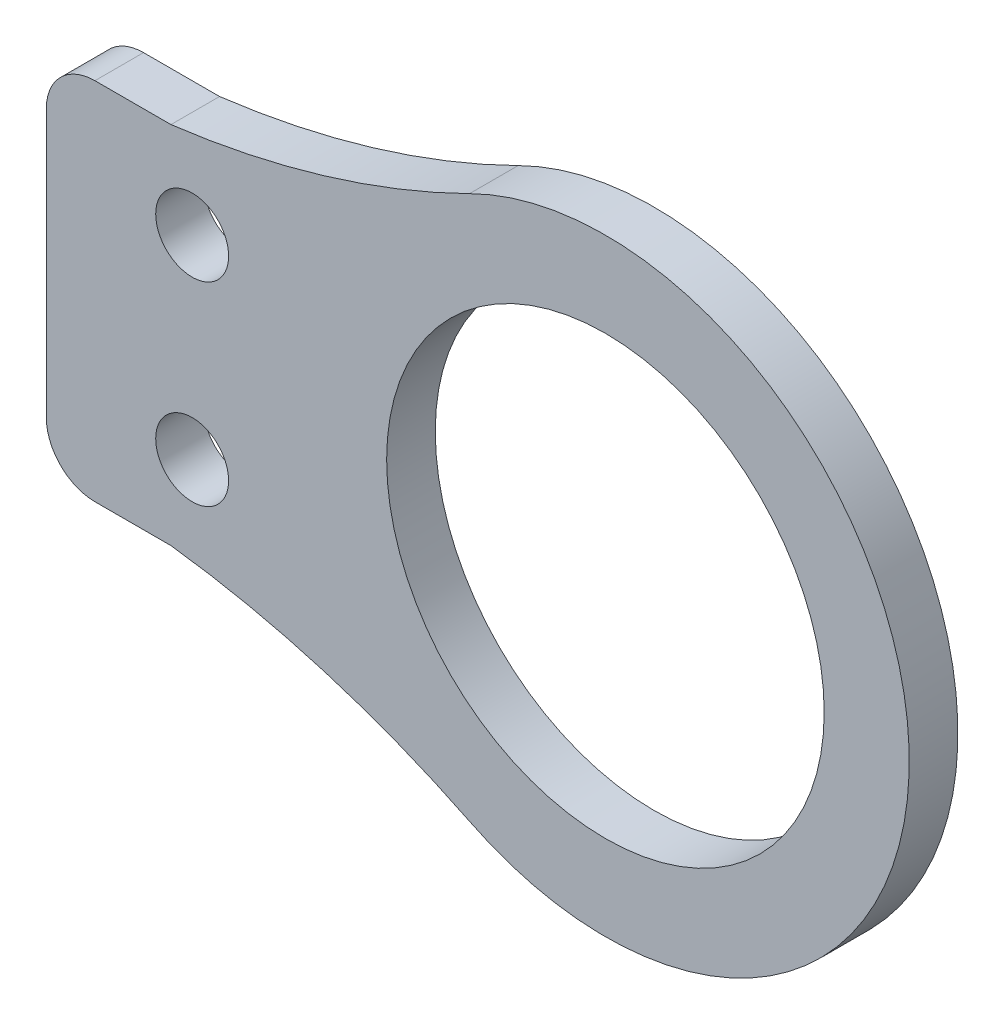
ISO-10303-21;
HEADER;
FILE_DESCRIPTION(('STEP AP214'),'2;1');
FILE_NAME('part.step','',(''),(''),'','','');
FILE_SCHEMA(('AUTOMOTIVE_DESIGN { 1 0 10303 214 1 1 1 1 }'));
ENDSEC;
DATA;
#1=APPLICATION_CONTEXT('core data for automotive mechanical design processes');
#2=APPLICATION_PROTOCOL_DEFINITION('international standard','automotive_design',2000,#1);
#3=PRODUCT_CONTEXT('',#1,'mechanical');
#4=PRODUCT('Part','Part','',(#3));
#5=PRODUCT_RELATED_PRODUCT_CATEGORY('part','',(#4));
#6=PRODUCT_DEFINITION_FORMATION('','',#4);
#7=PRODUCT_DEFINITION_CONTEXT('part definition',#1,'design');
#8=PRODUCT_DEFINITION('design','',#6,#7);
#9=PRODUCT_DEFINITION_SHAPE('','',#8);
#10=(LENGTH_UNIT() NAMED_UNIT(*) SI_UNIT(.MILLI.,.METRE.));
#11=(NAMED_UNIT(*) PLANE_ANGLE_UNIT() SI_UNIT($,.RADIAN.));
#12=(NAMED_UNIT(*) SI_UNIT($,.STERADIAN.) SOLID_ANGLE_UNIT());
#13=UNCERTAINTY_MEASURE_WITH_UNIT(LENGTH_MEASURE(1.E-05),#10,'distance_accuracy_value','');
#14=(GEOMETRIC_REPRESENTATION_CONTEXT(3) GLOBAL_UNCERTAINTY_ASSIGNED_CONTEXT((#13)) GLOBAL_UNIT_ASSIGNED_CONTEXT((#10,
#11,#12)) REPRESENTATION_CONTEXT('',''));
#15=CARTESIAN_POINT('',(0.,0.,0.));
#16=DIRECTION('',(0.,0.,1.));
#17=DIRECTION('',(1.,0.,0.));
#18=AXIS2_PLACEMENT_3D('',#15,#16,#17);
#19=CARTESIAN_POINT('',(0.,0.,1.));
#20=DIRECTION('',(0.,0.,-1.));
#21=DIRECTION('',(-1.,0.,0.));
#22=AXIS2_PLACEMENT_3D('',#19,#20,#21);
#23=CYLINDRICAL_SURFACE('',#22,12.5);
#24=DIRECTION('',(0.,0.,-1.));
#25=VECTOR('',#24,1.);
#26=CARTESIAN_POINT('',(-5.59081615330965,11.1800167593744,1.));
#27=LINE('',#26,#25);
#28=CARTESIAN_POINT('',(-5.59081615330965,11.1800167593744,1.));
#29=VERTEX_POINT('',#28);
#30=CARTESIAN_POINT('',(-5.59081615330965,11.1800167593744,-1.));
#31=VERTEX_POINT('',#30);
#32=EDGE_CURVE('E120',#29,#31,#27,.T.);
#33=ORIENTED_EDGE('',*,*,#32,.F.);
#34=CARTESIAN_POINT('',(0.,0.,1.));
#35=DIRECTION('',(0.,0.,1.));
#36=DIRECTION('',(1.,0.,0.));
#37=AXIS2_PLACEMENT_3D('',#34,#35,#36);
#38=CIRCLE('',#37,12.5);
#39=CARTESIAN_POINT('',(-5.59081615330965,-11.1800167593744,1.));
#40=VERTEX_POINT('',#39);
#41=EDGE_CURVE('E160',#40,#29,#38,.T.);
#42=ORIENTED_EDGE('',*,*,#41,.F.);
#43=DIRECTION('',(0.,0.,-1.));
#44=VECTOR('',#43,1.);
#45=CARTESIAN_POINT('',(-5.59081615330965,-11.1800167593744,1.));
#46=LINE('',#45,#44);
#47=CARTESIAN_POINT('',(-5.59081615330965,-11.1800167593744,-1.));
#48=VERTEX_POINT('',#47);
#49=EDGE_CURVE('E153',#40,#48,#46,.T.);
#50=ORIENTED_EDGE('',*,*,#49,.T.);
#51=CARTESIAN_POINT('',(0.,0.,-1.));
#52=DIRECTION('',(0.,0.,-1.));
#53=DIRECTION('',(-1.,0.,0.));
#54=AXIS2_PLACEMENT_3D('',#51,#52,#53);
#55=CIRCLE('',#54,12.5);
#56=EDGE_CURVE('E124',#31,#48,#55,.T.);
#57=ORIENTED_EDGE('',*,*,#56,.F.);
#58=EDGE_LOOP('',(#33,#42,#50,#57));
#59=FACE_BOUND('',#58,.T.);
#60=ADVANCED_FACE('F36',(#59),#23,.T.);
#61=CARTESIAN_POINT('',(0.,0.,1.));
#62=DIRECTION('',(0.,0.,1.));
#63=DIRECTION('',(1.,0.,0.));
#64=AXIS2_PLACEMENT_3D('',#61,#62,#63);
#65=PLANE('',#64);
#66=DIRECTION('',(0.,1.,0.));
#67=VECTOR('',#66,1.);
#68=CARTESIAN_POINT('',(-23.,0.,1.));
#69=LINE('',#68,#67);
#70=CARTESIAN_POINT('',(-23.,-5.5,1.));
#71=VERTEX_POINT('',#70);
#72=CARTESIAN_POINT('',(-23.,5.5,1.));
#73=VERTEX_POINT('',#72);
#74=EDGE_CURVE('E148',#71,#73,#69,.T.);
#75=ORIENTED_EDGE('',*,*,#74,.F.);
#76=CARTESIAN_POINT('',(-21.,-5.5,1.));
#77=DIRECTION('',(0.,0.,1.));
#78=DIRECTION('',(1.,0.,0.));
#79=AXIS2_PLACEMENT_3D('',#76,#77,#78);
#80=CIRCLE('',#79,2.);
#81=CARTESIAN_POINT('',(-21.,-7.5,1.));
#82=VERTEX_POINT('',#81);
#83=EDGE_CURVE('E44',#71,#82,#80,.T.);
#84=ORIENTED_EDGE('',*,*,#83,.T.);
#85=DIRECTION('',(-1.,0.,0.));
#86=VECTOR('',#85,1.);
#87=CARTESIAN_POINT('',(0.,-7.5,1.));
#88=LINE('',#87,#86);
#89=CARTESIAN_POINT('',(-17.8724312422313,-7.5,1.));
#90=VERTEX_POINT('',#89);
#91=EDGE_CURVE('E145',#90,#82,#88,.T.);
#92=ORIENTED_EDGE('',*,*,#91,.F.);
#93=CARTESIAN_POINT('',(-22.6143040962932,-45.6596505253202,1.));
#94=DIRECTION('',(0.,0.,-1.));
#95=DIRECTION('',(-1.,0.,0.));
#96=AXIS2_PLACEMENT_3D('',#93,#94,#95);
#97=CIRCLE('',#96,38.4531440376292);
#98=EDGE_CURVE('E142',#40,#90,#97,.F.);
#99=ORIENTED_EDGE('',*,*,#98,.F.);
#100=ORIENTED_EDGE('',*,*,#41,.T.);
#101=CARTESIAN_POINT('',(-22.6143040962932,45.6596505253202,1.));
#102=DIRECTION('',(0.,0.,-1.));
#103=DIRECTION('',(-1.,0.,0.));
#104=AXIS2_PLACEMENT_3D('',#101,#102,#103);
#105=CIRCLE('',#104,38.4531440376292);
#106=CARTESIAN_POINT('',(-17.8724312422313,7.5,1.));
#107=VERTEX_POINT('',#106);
#108=EDGE_CURVE('E151',#29,#107,#105,.T.);
#109=ORIENTED_EDGE('',*,*,#108,.T.);
#110=DIRECTION('',(-1.,0.,0.));
#111=VECTOR('',#110,1.);
#112=CARTESIAN_POINT('',(0.,7.5,1.));
#113=LINE('',#112,#111);
#114=CARTESIAN_POINT('',(-21.,7.5,1.));
#115=VERTEX_POINT('',#114);
#116=EDGE_CURVE('E117',#107,#115,#113,.T.);
#117=ORIENTED_EDGE('',*,*,#116,.T.);
#118=CARTESIAN_POINT('',(-21.,5.5,1.));
#119=DIRECTION('',(0.,0.,1.));
#120=DIRECTION('',(1.,0.,0.));
#121=AXIS2_PLACEMENT_3D('',#118,#119,#120);
#122=CIRCLE('',#121,2.);
#123=EDGE_CURVE('E56',#115,#73,#122,.T.);
#124=ORIENTED_EDGE('',*,*,#123,.T.);
#125=EDGE_LOOP('',(#75,#84,#92,#99,#100,#109,#117,#124));
#126=FACE_BOUND('',#125,.T.);
#127=CARTESIAN_POINT('',(0.,0.,1.));
#128=DIRECTION('',(0.,0.,1.));
#129=DIRECTION('',(1.,0.,0.));
#130=AXIS2_PLACEMENT_3D('',#127,#128,#129);
#131=CIRCLE('',#130,9.);
#132=CARTESIAN_POINT('',(9.,0.,1.));
#133=VERTEX_POINT('',#132);
#134=EDGE_CURVE('E154',#133,#133,#131,.T.);
#135=ORIENTED_EDGE('',*,*,#134,.F.);
#136=EDGE_LOOP('',(#135));
#137=FACE_BOUND('',#136,.T.);
#138=CARTESIAN_POINT('',(-17.,4.,1.));
#139=DIRECTION('',(0.,0.,-1.));
#140=DIRECTION('',(-1.,0.,0.));
#141=AXIS2_PLACEMENT_3D('',#138,#139,#140);
#142=CIRCLE('',#141,1.5);
#143=CARTESIAN_POINT('',(-18.5,4.,1.));
#144=VERTEX_POINT('',#143);
#145=EDGE_CURVE('E136',#144,#144,#142,.T.);
#146=ORIENTED_EDGE('',*,*,#145,.T.);
#147=EDGE_LOOP('',(#146));
#148=FACE_BOUND('',#147,.T.);
#149=CARTESIAN_POINT('',(-17.,-4.,1.));
#150=DIRECTION('',(0.,0.,-1.));
#151=DIRECTION('',(-1.,0.,0.));
#152=AXIS2_PLACEMENT_3D('',#149,#150,#151);
#153=CIRCLE('',#152,1.5);
#154=CARTESIAN_POINT('',(-18.5,-4.,1.));
#155=VERTEX_POINT('',#154);
#156=EDGE_CURVE('E139',#155,#155,#153,.T.);
#157=ORIENTED_EDGE('',*,*,#156,.T.);
#158=EDGE_LOOP('',(#157));
#159=FACE_BOUND('',#158,.T.);
#160=ADVANCED_FACE('F176',(#126,#137,#148,#159),#65,.T.);
#161=CARTESIAN_POINT('',(0.,0.,1.));
#162=DIRECTION('',(0.,0.,-1.));
#163=DIRECTION('',(-1.,0.,0.));
#164=AXIS2_PLACEMENT_3D('',#161,#162,#163);
#165=CYLINDRICAL_SURFACE('',#164,9.);
#166=ORIENTED_EDGE('',*,*,#134,.T.);
#167=EDGE_LOOP('',(#166));
#168=FACE_BOUND('',#167,.T.);
#169=CARTESIAN_POINT('',(0.,0.,-1.));
#170=DIRECTION('',(0.,0.,-1.));
#171=DIRECTION('',(-1.,0.,0.));
#172=AXIS2_PLACEMENT_3D('',#169,#170,#171);
#173=CIRCLE('',#172,9.);
#174=CARTESIAN_POINT('',(-9.,0.,-1.));
#175=VERTEX_POINT('',#174);
#176=EDGE_CURVE('E235',#175,#175,#173,.T.);
#177=ORIENTED_EDGE('',*,*,#176,.T.);
#178=EDGE_LOOP('',(#177));
#179=FACE_BOUND('',#178,.T.);
#180=ADVANCED_FACE('F201',(#168,#179),#165,.F.);
#181=CARTESIAN_POINT('',(-22.6143040962932,45.6596505253202,1.));
#182=DIRECTION('',(0.,0.,-1.));
#183=DIRECTION('',(-1.,0.,0.));
#184=AXIS2_PLACEMENT_3D('',#181,#182,#183);
#185=CYLINDRICAL_SURFACE('',#184,38.4531440376292);
#186=ORIENTED_EDGE('',*,*,#32,.T.);
#187=CARTESIAN_POINT('',(-22.6143040962932,45.6596505253202,-1.));
#188=DIRECTION('',(0.,0.,1.));
#189=DIRECTION('',(-1.,0.,0.));
#190=AXIS2_PLACEMENT_3D('',#187,#188,#189);
#191=CIRCLE('',#190,38.4531440376292);
#192=CARTESIAN_POINT('',(-17.8724312422313,7.5,-1.));
#193=VERTEX_POINT('',#192);
#194=EDGE_CURVE('E108',#193,#31,#191,.T.);
#195=ORIENTED_EDGE('',*,*,#194,.F.);
#196=DIRECTION('',(0.,0.,-1.));
#197=VECTOR('',#196,1.);
#198=CARTESIAN_POINT('',(-17.8724312422313,7.5,1.));
#199=LINE('',#198,#197);
#200=EDGE_CURVE('E115',#107,#193,#199,.T.);
#201=ORIENTED_EDGE('',*,*,#200,.F.);
#202=ORIENTED_EDGE('',*,*,#108,.F.);
#203=EDGE_LOOP('',(#186,#195,#201,#202));
#204=FACE_BOUND('',#203,.T.);
#205=ADVANCED_FACE('F123',(#204),#185,.F.);
#206=CARTESIAN_POINT('',(0.,7.5,1.));
#207=DIRECTION('',(0.,-1.,0.));
#208=DIRECTION('',(0.,0.,-1.));
#209=AXIS2_PLACEMENT_3D('',#206,#207,#208);
#210=PLANE('',#209);
#211=DIRECTION('',(1.,0.,0.));
#212=VECTOR('',#211,1.);
#213=CARTESIAN_POINT('',(-23.,7.5,-1.));
#214=LINE('',#213,#212);
#215=CARTESIAN_POINT('',(-21.,7.5,-1.));
#216=VERTEX_POINT('',#215);
#217=EDGE_CURVE('E101',#216,#193,#214,.T.);
#218=ORIENTED_EDGE('',*,*,#217,.F.);
#219=DIRECTION('',(0.,0.,-1.));
#220=VECTOR('',#219,1.);
#221=CARTESIAN_POINT('',(-21.,7.5,1.));
#222=LINE('',#221,#220);
#223=EDGE_CURVE('E11',#216,#115,#222,.F.);
#224=ORIENTED_EDGE('',*,*,#223,.T.);
#225=ORIENTED_EDGE('',*,*,#116,.F.);
#226=ORIENTED_EDGE('',*,*,#200,.T.);
#227=EDGE_LOOP('',(#218,#224,#225,#226));
#228=FACE_BOUND('',#227,.T.);
#229=ADVANCED_FACE('F116',(#228),#210,.F.);
#230=CARTESIAN_POINT('',(-23.,0.,1.));
#231=DIRECTION('',(-1.,0.,0.));
#232=DIRECTION('',(0.,0.,1.));
#233=AXIS2_PLACEMENT_3D('',#230,#231,#232);
#234=PLANE('',#233);
#235=DIRECTION('',(0.,1.,0.));
#236=VECTOR('',#235,1.);
#237=CARTESIAN_POINT('',(-23.,-7.5,-1.));
#238=LINE('',#237,#236);
#239=CARTESIAN_POINT('',(-23.,-5.5,-1.));
#240=VERTEX_POINT('',#239);
#241=CARTESIAN_POINT('',(-23.,5.5,-1.));
#242=VERTEX_POINT('',#241);
#243=EDGE_CURVE('E134',#240,#242,#238,.T.);
#244=ORIENTED_EDGE('',*,*,#243,.F.);
#245=DIRECTION('',(0.,0.,-1.));
#246=VECTOR('',#245,1.);
#247=CARTESIAN_POINT('',(-23.,-5.5,1.));
#248=LINE('',#247,#246);
#249=EDGE_CURVE('E172',#240,#71,#248,.F.);
#250=ORIENTED_EDGE('',*,*,#249,.T.);
#251=ORIENTED_EDGE('',*,*,#74,.T.);
#252=DIRECTION('',(0.,0.,-1.));
#253=VECTOR('',#252,1.);
#254=CARTESIAN_POINT('',(-23.,5.5,-1.));
#255=LINE('',#254,#253);
#256=EDGE_CURVE('E169',#73,#242,#255,.T.);
#257=ORIENTED_EDGE('',*,*,#256,.T.);
#258=EDGE_LOOP('',(#244,#250,#251,#257));
#259=FACE_BOUND('',#258,.T.);
#260=ADVANCED_FACE('F188',(#259),#234,.T.);
#261=CARTESIAN_POINT('',(0.,-7.5,1.));
#262=DIRECTION('',(0.,-1.,0.));
#263=DIRECTION('',(0.,0.,-1.));
#264=AXIS2_PLACEMENT_3D('',#261,#262,#263);
#265=PLANE('',#264);
#266=ORIENTED_EDGE('',*,*,#91,.T.);
#267=DIRECTION('',(0.,0.,-1.));
#268=VECTOR('',#267,1.);
#269=CARTESIAN_POINT('',(-21.,-7.5,1.));
#270=LINE('',#269,#268);
#271=CARTESIAN_POINT('',(-21.,-7.5,-1.));
#272=VERTEX_POINT('',#271);
#273=EDGE_CURVE('E163',#82,#272,#270,.T.);
#274=ORIENTED_EDGE('',*,*,#273,.T.);
#275=DIRECTION('',(-1.,0.,0.));
#276=VECTOR('',#275,1.);
#277=CARTESIAN_POINT('',(-17.8724312422313,-7.5,-1.));
#278=LINE('',#277,#276);
#279=CARTESIAN_POINT('',(-17.8724312422313,-7.5,-1.));
#280=VERTEX_POINT('',#279);
#281=EDGE_CURVE('E132',#280,#272,#278,.T.);
#282=ORIENTED_EDGE('',*,*,#281,.F.);
#283=DIRECTION('',(0.,0.,-1.));
#284=VECTOR('',#283,1.);
#285=CARTESIAN_POINT('',(-17.8724312422313,-7.5,1.));
#286=LINE('',#285,#284);
#287=EDGE_CURVE('E121',#90,#280,#286,.T.);
#288=ORIENTED_EDGE('',*,*,#287,.F.);
#289=EDGE_LOOP('',(#266,#274,#282,#288));
#290=FACE_BOUND('',#289,.T.);
#291=ADVANCED_FACE('F183',(#290),#265,.T.);
#292=CARTESIAN_POINT('',(-17.,-4.,1.));
#293=DIRECTION('',(0.,0.,-1.));
#294=DIRECTION('',(-1.,0.,0.));
#295=AXIS2_PLACEMENT_3D('',#292,#293,#294);
#296=CYLINDRICAL_SURFACE('',#295,1.5);
#297=ORIENTED_EDGE('',*,*,#156,.F.);
#298=EDGE_LOOP('',(#297));
#299=FACE_BOUND('',#298,.T.);
#300=CARTESIAN_POINT('',(-17.,-4.,-1.));
#301=DIRECTION('',(0.,0.,-1.));
#302=DIRECTION('',(-1.,0.,0.));
#303=AXIS2_PLACEMENT_3D('',#300,#301,#302);
#304=CIRCLE('',#303,1.5);
#305=CARTESIAN_POINT('',(-18.5,-4.,-1.));
#306=VERTEX_POINT('',#305);
#307=EDGE_CURVE('E112',#306,#306,#304,.T.);
#308=ORIENTED_EDGE('',*,*,#307,.T.);
#309=EDGE_LOOP('',(#308));
#310=FACE_BOUND('',#309,.T.);
#311=ADVANCED_FACE('F211',(#299,#310),#296,.F.);
#312=CARTESIAN_POINT('',(-17.,4.,1.));
#313=DIRECTION('',(0.,0.,-1.));
#314=DIRECTION('',(-1.,0.,0.));
#315=AXIS2_PLACEMENT_3D('',#312,#313,#314);
#316=CYLINDRICAL_SURFACE('',#315,1.5);
#317=ORIENTED_EDGE('',*,*,#145,.F.);
#318=EDGE_LOOP('',(#317));
#319=FACE_BOUND('',#318,.T.);
#320=CARTESIAN_POINT('',(-17.,4.,-1.));
#321=DIRECTION('',(0.,0.,-1.));
#322=DIRECTION('',(-1.,0.,0.));
#323=AXIS2_PLACEMENT_3D('',#320,#321,#322);
#324=CIRCLE('',#323,1.5);
#325=CARTESIAN_POINT('',(-18.5,4.,-1.));
#326=VERTEX_POINT('',#325);
#327=EDGE_CURVE('E233',#326,#326,#324,.T.);
#328=ORIENTED_EDGE('',*,*,#327,.T.);
#329=EDGE_LOOP('',(#328));
#330=FACE_BOUND('',#329,.T.);
#331=ADVANCED_FACE('F207',(#319,#330),#316,.F.);
#332=CARTESIAN_POINT('',(-22.6143040962932,-45.6596505253202,1.));
#333=DIRECTION('',(0.,0.,-1.));
#334=DIRECTION('',(-1.,0.,0.));
#335=AXIS2_PLACEMENT_3D('',#332,#333,#334);
#336=CYLINDRICAL_SURFACE('',#335,38.4531440376292);
#337=ORIENTED_EDGE('',*,*,#287,.T.);
#338=CARTESIAN_POINT('',(-22.6143040962932,-45.6596505253202,-1.));
#339=DIRECTION('',(0.,0.,1.));
#340=DIRECTION('',(-1.,0.,0.));
#341=AXIS2_PLACEMENT_3D('',#338,#339,#340);
#342=CIRCLE('',#341,38.4531440376292);
#343=EDGE_CURVE('E126',#48,#280,#342,.T.);
#344=ORIENTED_EDGE('',*,*,#343,.F.);
#345=ORIENTED_EDGE('',*,*,#49,.F.);
#346=ORIENTED_EDGE('',*,*,#98,.T.);
#347=EDGE_LOOP('',(#337,#344,#345,#346));
#348=FACE_BOUND('',#347,.T.);
#349=ADVANCED_FACE('F210',(#348),#336,.F.);
#350=CARTESIAN_POINT('',(-22.6143040962932,45.6596505253202,-1.));
#351=DIRECTION('',(0.,0.,-1.));
#352=DIRECTION('',(-1.,0.,0.));
#353=AXIS2_PLACEMENT_3D('',#350,#351,#352);
#354=PLANE('',#353);
#355=ORIENTED_EDGE('',*,*,#327,.F.);
#356=EDGE_LOOP('',(#355));
#357=FACE_BOUND('',#356,.T.);
#358=ORIENTED_EDGE('',*,*,#281,.T.);
#359=CARTESIAN_POINT('',(-21.,-5.5,-1.));
#360=DIRECTION('',(0.,0.,-1.));
#361=DIRECTION('',(-1.,0.,0.));
#362=AXIS2_PLACEMENT_3D('',#359,#360,#361);
#363=CIRCLE('',#362,2.);
#364=EDGE_CURVE('E167',#272,#240,#363,.T.);
#365=ORIENTED_EDGE('',*,*,#364,.T.);
#366=ORIENTED_EDGE('',*,*,#243,.T.);
#367=CARTESIAN_POINT('',(-21.,5.5,-1.));
#368=DIRECTION('',(0.,0.,-1.));
#369=DIRECTION('',(-1.,0.,0.));
#370=AXIS2_PLACEMENT_3D('',#367,#368,#369);
#371=CIRCLE('',#370,2.);
#372=EDGE_CURVE('E111',#242,#216,#371,.T.);
#373=ORIENTED_EDGE('',*,*,#372,.T.);
#374=ORIENTED_EDGE('',*,*,#217,.T.);
#375=ORIENTED_EDGE('',*,*,#194,.T.);
#376=ORIENTED_EDGE('',*,*,#56,.T.);
#377=ORIENTED_EDGE('',*,*,#343,.T.);
#378=EDGE_LOOP('',(#358,#365,#366,#373,#374,#375,#376,#377));
#379=FACE_BOUND('',#378,.T.);
#380=ORIENTED_EDGE('',*,*,#307,.F.);
#381=EDGE_LOOP('',(#380));
#382=FACE_BOUND('',#381,.T.);
#383=ORIENTED_EDGE('',*,*,#176,.F.);
#384=EDGE_LOOP('',(#383));
#385=FACE_BOUND('',#384,.T.);
#386=ADVANCED_FACE('F104',(#357,#379,#382,#385),#354,.T.);
#387=CARTESIAN_POINT('',(-21.,-5.5,1.));
#388=DIRECTION('',(0.,0.,-1.));
#389=DIRECTION('',(-1.,0.,0.));
#390=AXIS2_PLACEMENT_3D('',#387,#388,#389);
#391=CYLINDRICAL_SURFACE('',#390,2.);
#392=ORIENTED_EDGE('',*,*,#83,.F.);
#393=ORIENTED_EDGE('',*,*,#249,.F.);
#394=ORIENTED_EDGE('',*,*,#364,.F.);
#395=ORIENTED_EDGE('',*,*,#273,.F.);
#396=EDGE_LOOP('',(#392,#393,#394,#395));
#397=FACE_BOUND('',#396,.T.);
#398=ADVANCED_FACE('F185',(#397),#391,.T.);
#399=CARTESIAN_POINT('',(-21.,5.5,1.));
#400=DIRECTION('',(0.,0.,1.));
#401=DIRECTION('',(1.,0.,0.));
#402=AXIS2_PLACEMENT_3D('',#399,#400,#401);
#403=CYLINDRICAL_SURFACE('',#402,2.);
#404=ORIENTED_EDGE('',*,*,#123,.F.);
#405=ORIENTED_EDGE('',*,*,#223,.F.);
#406=ORIENTED_EDGE('',*,*,#372,.F.);
#407=ORIENTED_EDGE('',*,*,#256,.F.);
#408=EDGE_LOOP('',(#404,#405,#406,#407));
#409=FACE_BOUND('',#408,.T.);
#410=ADVANCED_FACE('F38',(#409),#403,.T.);
#411=CLOSED_SHELL('',(#60,#160,#180,#205,#229,#260,#291,#311,#331,#349,#386,#398,#410));
#412=MANIFOLD_SOLID_BREP('B2',#411);
#413=ADVANCED_BREP_SHAPE_REPRESENTATION('',(#18,#412),#14);
#414=SHAPE_DEFINITION_REPRESENTATION(#9,#413);
ENDSEC;
END-ISO-10303-21;
